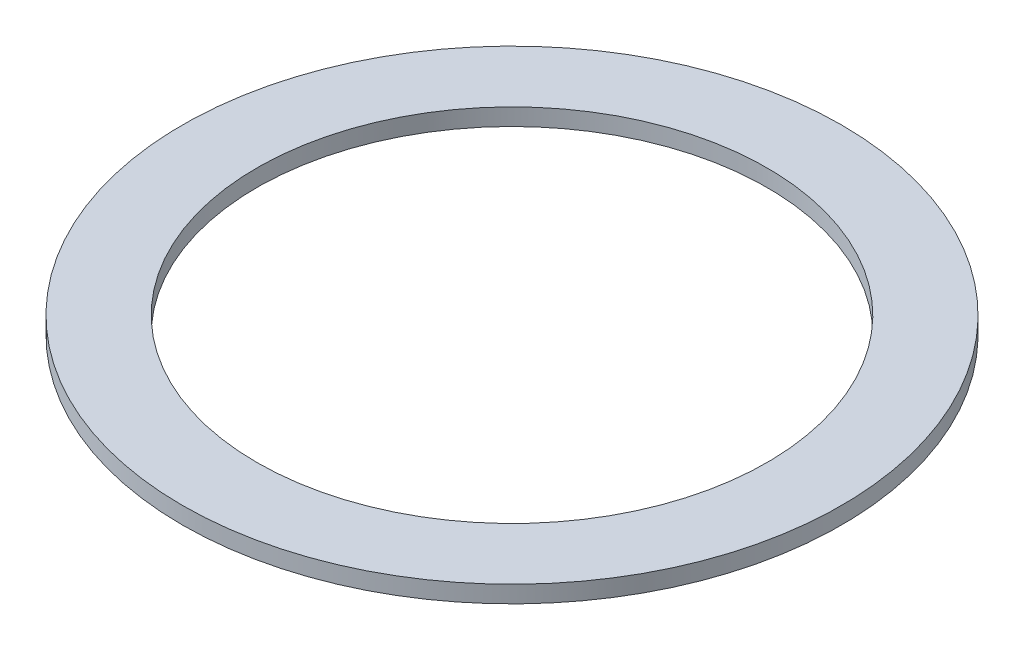
ISO-10303-21;
HEADER;
FILE_DESCRIPTION(('STEP AP214'),'2;1');
FILE_NAME('part.step','',(''),(''),'','','');
FILE_SCHEMA(('AUTOMOTIVE_DESIGN { 1 0 10303 214 1 1 1 1 }'));
ENDSEC;
DATA;
#1=APPLICATION_CONTEXT('core data for automotive mechanical design processes');
#2=APPLICATION_PROTOCOL_DEFINITION('international standard','automotive_design',2000,#1);
#3=PRODUCT_CONTEXT('',#1,'mechanical');
#4=PRODUCT('Part','Part','',(#3));
#5=PRODUCT_RELATED_PRODUCT_CATEGORY('part','',(#4));
#6=PRODUCT_DEFINITION_FORMATION('','',#4);
#7=PRODUCT_DEFINITION_CONTEXT('part definition',#1,'design');
#8=PRODUCT_DEFINITION('design','',#6,#7);
#9=PRODUCT_DEFINITION_SHAPE('','',#8);
#10=(LENGTH_UNIT() NAMED_UNIT(*) SI_UNIT(.MILLI.,.METRE.));
#11=(NAMED_UNIT(*) PLANE_ANGLE_UNIT() SI_UNIT($,.RADIAN.));
#12=(NAMED_UNIT(*) SI_UNIT($,.STERADIAN.) SOLID_ANGLE_UNIT());
#13=UNCERTAINTY_MEASURE_WITH_UNIT(LENGTH_MEASURE(1.E-05),#10,'distance_accuracy_value','');
#14=(GEOMETRIC_REPRESENTATION_CONTEXT(3) GLOBAL_UNCERTAINTY_ASSIGNED_CONTEXT((#13)) GLOBAL_UNIT_ASSIGNED_CONTEXT((#10,
#11,#12)) REPRESENTATION_CONTEXT('',''));
#15=CARTESIAN_POINT('',(0.,0.,0.));
#16=DIRECTION('',(0.,0.,1.));
#17=DIRECTION('',(1.,0.,0.));
#18=AXIS2_PLACEMENT_3D('',#15,#16,#17);
#19=CARTESIAN_POINT('',(0.,4.,0.));
#20=DIRECTION('',(0.,1.,0.));
#21=DIRECTION('',(0.,0.,1.));
#22=AXIS2_PLACEMENT_3D('',#19,#20,#21);
#23=PLANE('',#22);
#24=CARTESIAN_POINT('',(0.,4.,0.));
#25=DIRECTION('',(0.,1.,0.));
#26=DIRECTION('',(0.,0.,1.));
#27=AXIS2_PLACEMENT_3D('',#24,#25,#26);
#28=CIRCLE('',#27,77.5);
#29=CARTESIAN_POINT('',(0.,4.,77.5));
#30=VERTEX_POINT('',#29);
#31=EDGE_CURVE('E10',#30,#30,#28,.T.);
#32=ORIENTED_EDGE('',*,*,#31,.T.);
#33=EDGE_LOOP('',(#32));
#34=FACE_BOUND('',#33,.T.);
#35=CARTESIAN_POINT('',(0.,4.,0.));
#36=DIRECTION('',(0.,1.,0.));
#37=DIRECTION('',(0.,0.,1.));
#38=AXIS2_PLACEMENT_3D('',#35,#36,#37);
#39=CIRCLE('',#38,60.);
#40=CARTESIAN_POINT('',(0.,4.,60.));
#41=VERTEX_POINT('',#40);
#42=EDGE_CURVE('E41',#41,#41,#39,.T.);
#43=ORIENTED_EDGE('',*,*,#42,.F.);
#44=EDGE_LOOP('',(#43));
#45=FACE_BOUND('',#44,.T.);
#46=ADVANCED_FACE('F30',(#34,#45),#23,.T.);
#47=CARTESIAN_POINT('',(0.,0.,0.));
#48=DIRECTION('',(0.,1.,0.));
#49=DIRECTION('',(0.,0.,1.));
#50=AXIS2_PLACEMENT_3D('',#47,#48,#49);
#51=PLANE('',#50);
#52=CARTESIAN_POINT('',(0.,0.,0.));
#53=DIRECTION('',(0.,1.,0.));
#54=DIRECTION('',(0.,0.,1.));
#55=AXIS2_PLACEMENT_3D('',#52,#53,#54);
#56=CIRCLE('',#55,77.5);
#57=CARTESIAN_POINT('',(0.,0.,77.5));
#58=VERTEX_POINT('',#57);
#59=EDGE_CURVE('E34',#58,#58,#56,.T.);
#60=ORIENTED_EDGE('',*,*,#59,.F.);
#61=EDGE_LOOP('',(#60));
#62=FACE_BOUND('',#61,.T.);
#63=CARTESIAN_POINT('',(0.,0.,0.));
#64=DIRECTION('',(0.,1.,0.));
#65=DIRECTION('',(0.,0.,1.));
#66=AXIS2_PLACEMENT_3D('',#63,#64,#65);
#67=CIRCLE('',#66,60.);
#68=CARTESIAN_POINT('',(0.,0.,60.));
#69=VERTEX_POINT('',#68);
#70=EDGE_CURVE('E43',#69,#69,#67,.T.);
#71=ORIENTED_EDGE('',*,*,#70,.T.);
#72=EDGE_LOOP('',(#71));
#73=FACE_BOUND('',#72,.T.);
#74=ADVANCED_FACE('F53',(#62,#73),#51,.F.);
#75=CARTESIAN_POINT('',(0.,4.,0.));
#76=DIRECTION('',(0.,-1.,0.));
#77=DIRECTION('',(0.,0.,-1.));
#78=AXIS2_PLACEMENT_3D('',#75,#76,#77);
#79=CYLINDRICAL_SURFACE('',#78,77.5);
#80=ORIENTED_EDGE('',*,*,#31,.F.);
#81=EDGE_LOOP('',(#80));
#82=FACE_BOUND('',#81,.T.);
#83=ORIENTED_EDGE('',*,*,#59,.T.);
#84=EDGE_LOOP('',(#83));
#85=FACE_BOUND('',#84,.T.);
#86=ADVANCED_FACE('F32',(#82,#85),#79,.T.);
#87=CARTESIAN_POINT('',(0.,4.,0.));
#88=DIRECTION('',(0.,-1.,0.));
#89=DIRECTION('',(0.,0.,-1.));
#90=AXIS2_PLACEMENT_3D('',#87,#88,#89);
#91=CYLINDRICAL_SURFACE('',#90,60.);
#92=ORIENTED_EDGE('',*,*,#42,.T.);
#93=EDGE_LOOP('',(#92));
#94=FACE_BOUND('',#93,.T.);
#95=ORIENTED_EDGE('',*,*,#70,.F.);
#96=EDGE_LOOP('',(#95));
#97=FACE_BOUND('',#96,.T.);
#98=ADVANCED_FACE('F49',(#94,#97),#91,.F.);
#99=CLOSED_SHELL('',(#46,#74,#86,#98));
#100=MANIFOLD_SOLID_BREP('B2',#99);
#101=ADVANCED_BREP_SHAPE_REPRESENTATION('',(#18,#100),#14);
#102=SHAPE_DEFINITION_REPRESENTATION(#9,#101);
ENDSEC;
END-ISO-10303-21;
